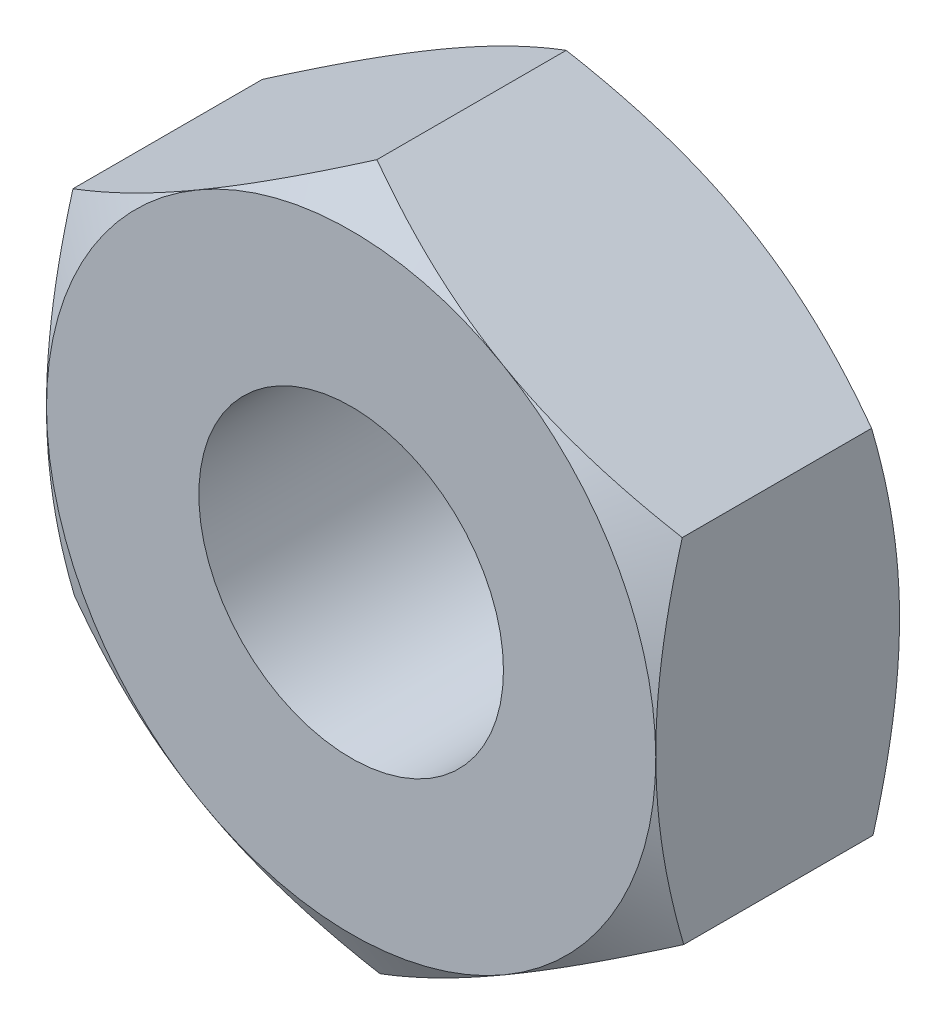
ISO-10303-21;
HEADER;
FILE_DESCRIPTION(('STEP AP214'),'2;1');
FILE_NAME('part.step','',(''),(''),'','','');
FILE_SCHEMA(('AUTOMOTIVE_DESIGN { 1 0 10303 214 1 1 1 1 }'));
ENDSEC;
DATA;
#1=APPLICATION_CONTEXT('core data for automotive mechanical design processes');
#2=APPLICATION_PROTOCOL_DEFINITION('international standard','automotive_design',2000,#1);
#3=PRODUCT_CONTEXT('',#1,'mechanical');
#4=PRODUCT('Part','Part','',(#3));
#5=PRODUCT_RELATED_PRODUCT_CATEGORY('part','',(#4));
#6=PRODUCT_DEFINITION_FORMATION('','',#4);
#7=PRODUCT_DEFINITION_CONTEXT('part definition',#1,'design');
#8=PRODUCT_DEFINITION('design','',#6,#7);
#9=PRODUCT_DEFINITION_SHAPE('','',#8);
#10=(LENGTH_UNIT() NAMED_UNIT(*) SI_UNIT(.MILLI.,.METRE.));
#11=(NAMED_UNIT(*) PLANE_ANGLE_UNIT() SI_UNIT($,.RADIAN.));
#12=(NAMED_UNIT(*) SI_UNIT($,.STERADIAN.) SOLID_ANGLE_UNIT());
#13=UNCERTAINTY_MEASURE_WITH_UNIT(LENGTH_MEASURE(1.E-05),#10,'distance_accuracy_value','');
#14=(GEOMETRIC_REPRESENTATION_CONTEXT(3) GLOBAL_UNCERTAINTY_ASSIGNED_CONTEXT((#13)) GLOBAL_UNIT_ASSIGNED_CONTEXT((#10,
#11,#12)) REPRESENTATION_CONTEXT('',''));
#15=CARTESIAN_POINT('',(0.,0.,0.));
#16=DIRECTION('',(0.,0.,1.));
#17=DIRECTION('',(1.,0.,0.));
#18=AXIS2_PLACEMENT_3D('',#15,#16,#17);
#19=CARTESIAN_POINT('',(0.,0.,4.));
#20=DIRECTION('',(0.,0.,1.));
#21=DIRECTION('',(1.,0.,0.));
#22=AXIS2_PLACEMENT_3D('',#19,#20,#21);
#23=PLANE('',#22);
#24=CARTESIAN_POINT('',(0.,0.,4.));
#25=DIRECTION('',(0.,0.,1.));
#26=DIRECTION('',(1.,0.,0.));
#27=AXIS2_PLACEMENT_3D('',#24,#25,#26);
#28=CIRCLE('',#27,5.);
#29=CARTESIAN_POINT('',(5.,0.,4.));
#30=VERTEX_POINT('',#29);
#31=EDGE_CURVE('E256',#30,#30,#28,.T.);
#32=ORIENTED_EDGE('',*,*,#31,.F.);
#33=EDGE_LOOP('',(#32));
#34=FACE_BOUND('',#33,.T.);
#35=CARTESIAN_POINT('',(0.,0.,4.));
#36=DIRECTION('',(0.,0.,1.));
#37=DIRECTION('',(1.,0.,0.));
#38=AXIS2_PLACEMENT_3D('',#35,#36,#37);
#39=CIRCLE('',#38,10.);
#40=CARTESIAN_POINT('',(5.03532607512234,-8.63976222573244,4.));
#41=VERTEX_POINT('',#40);
#42=CARTESIAN_POINT('',(-4.9645905325803,-8.68060141026035,4.));
#43=VERTEX_POINT('',#42);
#44=EDGE_CURVE('E12',#41,#43,#39,.F.);
#45=ORIENTED_EDGE('',*,*,#44,.F.);
#46=CARTESIAN_POINT('',(9.99991660770264,0.0408391845279188,4.));
#47=VERTEX_POINT('',#46);
#48=EDGE_CURVE('E50',#47,#41,#39,.F.);
#49=ORIENTED_EDGE('',*,*,#48,.F.);
#50=CARTESIAN_POINT('',(4.96459053258031,8.68060141026035,4.));
#51=VERTEX_POINT('',#50);
#52=EDGE_CURVE('E160',#51,#47,#39,.F.);
#53=ORIENTED_EDGE('',*,*,#52,.F.);
#54=CARTESIAN_POINT('',(0.,0.,4.));
#55=DIRECTION('',(0.,0.,-1.));
#56=DIRECTION('',(-1.,0.,0.));
#57=AXIS2_PLACEMENT_3D('',#54,#55,#56);
#58=CIRCLE('',#57,10.);
#59=CARTESIAN_POINT('',(-5.03532607512234,8.63976222573243,4.));
#60=VERTEX_POINT('',#59);
#61=EDGE_CURVE('E219',#60,#51,#58,.T.);
#62=ORIENTED_EDGE('',*,*,#61,.F.);
#63=CARTESIAN_POINT('',(-9.99991660770264,-0.0408391845279113,4.));
#64=VERTEX_POINT('',#63);
#65=EDGE_CURVE('E389',#64,#60,#39,.F.);
#66=ORIENTED_EDGE('',*,*,#65,.F.);
#67=EDGE_CURVE('E56',#43,#64,#39,.F.);
#68=ORIENTED_EDGE('',*,*,#67,.F.);
#69=EDGE_LOOP('',(#45,#49,#53,#62,#66,#68));
#70=FACE_BOUND('',#69,.T.);
#71=ADVANCED_FACE('F45',(#34,#70),#23,.T.);
#72=CARTESIAN_POINT('',(0.,0.,-4.));
#73=DIRECTION('',(0.,0.,1.));
#74=DIRECTION('',(1.,0.,0.));
#75=AXIS2_PLACEMENT_3D('',#72,#73,#74);
#76=PLANE('',#75);
#77=CARTESIAN_POINT('',(0.,0.,-4.));
#78=DIRECTION('',(0.,0.,1.));
#79=DIRECTION('',(1.,0.,0.));
#80=AXIS2_PLACEMENT_3D('',#77,#78,#79);
#81=CIRCLE('',#80,5.);
#82=CARTESIAN_POINT('',(5.,0.,-4.));
#83=VERTEX_POINT('',#82);
#84=EDGE_CURVE('E257',#83,#83,#81,.T.);
#85=ORIENTED_EDGE('',*,*,#84,.T.);
#86=EDGE_LOOP('',(#85));
#87=FACE_BOUND('',#86,.T.);
#88=CARTESIAN_POINT('',(0.,0.,-4.));
#89=DIRECTION('',(0.,0.,-1.));
#90=DIRECTION('',(-1.,0.,0.));
#91=AXIS2_PLACEMENT_3D('',#88,#89,#90);
#92=CIRCLE('',#91,10.);
#93=CARTESIAN_POINT('',(4.96459053258031,8.68060141026036,-4.));
#94=VERTEX_POINT('',#93);
#95=CARTESIAN_POINT('',(9.99991660770264,0.0408391845279188,-4.));
#96=VERTEX_POINT('',#95);
#97=EDGE_CURVE('E326',#94,#96,#92,.T.);
#98=ORIENTED_EDGE('',*,*,#97,.T.);
#99=CARTESIAN_POINT('',(5.03532607512234,-8.63976222573243,-4.));
#100=VERTEX_POINT('',#99);
#101=EDGE_CURVE('E333',#96,#100,#92,.T.);
#102=ORIENTED_EDGE('',*,*,#101,.T.);
#103=CARTESIAN_POINT('',(-4.9645905325803,-8.68060141026035,-4.));
#104=VERTEX_POINT('',#103);
#105=EDGE_CURVE('E322',#100,#104,#92,.T.);
#106=ORIENTED_EDGE('',*,*,#105,.T.);
#107=CARTESIAN_POINT('',(-9.99991660770264,-0.0408391845279113,-4.));
#108=VERTEX_POINT('',#107);
#109=EDGE_CURVE('E316',#104,#108,#92,.T.);
#110=ORIENTED_EDGE('',*,*,#109,.T.);
#111=CARTESIAN_POINT('',(-5.03532607512234,8.63976222573244,-4.));
#112=VERTEX_POINT('',#111);
#113=EDGE_CURVE('E313',#108,#112,#92,.T.);
#114=ORIENTED_EDGE('',*,*,#113,.T.);
#115=EDGE_CURVE('E317',#112,#94,#92,.T.);
#116=ORIENTED_EDGE('',*,*,#115,.T.);
#117=EDGE_LOOP('',(#98,#102,#106,#110,#114,#116));
#118=FACE_BOUND('',#117,.T.);
#119=ADVANCED_FACE('F227',(#87,#118),#76,.F.);
#120=CARTESIAN_POINT('',(0.0471570283613514,-11.5469090906619,4.));
#121=DIRECTION('',(-0.503532607512233,0.863976222573243,0.));
#122=DIRECTION('',(-0.863976222573244,-0.503532607512234,0.));
#123=AXIS2_PLACEMENT_3D('',#120,#121,#122);
#124=PLANE('',#123);
#125=DIRECTION('',(0.,0.,-1.));
#126=VECTOR('',#125,1.);
#127=CARTESIAN_POINT('',(10.0234951218833,-5.73261536080301,4.));
#128=LINE('',#127,#126);
#129=CARTESIAN_POINT('',(10.0234951218833,-5.73261536080301,3.1068360252296));
#130=VERTEX_POINT('',#129);
#131=CARTESIAN_POINT('',(10.0234951218833,-5.73261536080301,-3.1068360252296));
#132=VERTEX_POINT('',#131);
#133=EDGE_CURVE('E165',#130,#132,#128,.T.);
#134=ORIENTED_EDGE('',*,*,#133,.F.);
#135=CARTESIAN_POINT('',(10.0236951218833,-5.73249879912125,3.10676919943801));
#136=CARTESIAN_POINT('',(9.8043934824191,-5.86030963866292,3.18003117071796));
#137=CARTESIAN_POINT('',(9.58427417198534,-5.98859702372126,3.24996801006524));
#138=CARTESIAN_POINT('',(9.14227035786886,-6.24620056330658,3.38226880062709));
#139=CARTESIAN_POINT('',(8.92038529903801,-6.37551704137856,3.44463026113388));
#140=CARTESIAN_POINT('',(8.25115488474094,-6.7655501542504,3.61914472962219));
#141=CARTESIAN_POINT('',(7.80116765317343,-7.02780649665708,3.71840771304211));
#142=CARTESIAN_POINT('',(7.12778236221893,-7.42026110658237,3.83480275689092));
#143=CARTESIAN_POINT('',(6.90639608398435,-7.5492868911287,3.86795931829593));
#144=CARTESIAN_POINT('',(6.4625985250812,-7.80793584025892,3.9235607234498));
#145=CARTESIAN_POINT('',(6.24018722476748,-7.93755901629217,3.94600536102896));
#146=CARTESIAN_POINT('',(5.79499362957969,-8.19702158710805,3.97960783245586));
#147=CARTESIAN_POINT('',(5.57221209219253,-8.32686054042095,3.99077907887235));
#148=CARTESIAN_POINT('',(5.1264432397431,-8.58665837600614,4.00159739053961));
#149=CARTESIAN_POINT('',(4.90345593125148,-8.71661725444901,4.00124481184567));
#150=CARTESIAN_POINT('',(4.48657631588531,-8.95957819973848,3.98981719704419));
#151=CARTESIAN_POINT('',(4.29265458448195,-9.07259741544791,3.98013618860361));
#152=CARTESIAN_POINT('',(3.90526466407321,-9.29837151854348,3.95224652128214));
#153=CARTESIAN_POINT('',(3.71179650812355,-9.41112638666446,3.9340372591729));
#154=CARTESIAN_POINT('',(3.13214168623567,-9.74895409105769,3.86704760285208));
#155=CARTESIAN_POINT('',(2.74698104881237,-9.97342894928376,3.80591368481485));
#156=CARTESIAN_POINT('',(1.97257417130124,-10.4247597893238,3.65307842197185));
#157=CARTESIAN_POINT('',(1.58342676141163,-10.6515581720672,3.56072923483583));
#158=CARTESIAN_POINT('',(0.810935032241205,-11.1017728475501,3.35113496669802));
#159=CARTESIAN_POINT('',(0.42758082110536,-11.325194905346,3.23393911169943));
#160=CARTESIAN_POINT('',(0.0469570283613517,-11.5470256523436,3.10676919943801));
#161=B_SPLINE_CURVE_WITH_KNOTS('',3,(#135,#136,#137,#138,#139,#140,#141,#142,#143,#144,#145,
#146,#147,#148,#149,#150,#151,#152,#153,#154,#155,#156,#157,#158,#159,#160),.UNSPECIFIED.,.F.,
.F.,(4,2,2,2,2,2,2,2,2,2,2,2,4),(0.,0.792505395803816,1.58527065810783,3.17417596925612,
3.94912788860386,4.72409472265379,5.49813844545388,6.27215825240161,6.94597423179127,
7.61983787935609,8.96852276378645,10.3471181760619,11.7230074323937),.UNSPECIFIED.);
#162=EDGE_CURVE('E147',#130,#41,#161,.T.);
#163=ORIENTED_EDGE('',*,*,#162,.T.);
#164=CARTESIAN_POINT('',(0.0471570283613516,-11.5469090906619,3.1068360252296));
#165=VERTEX_POINT('',#164);
#166=EDGE_CURVE('E136',#41,#165,#161,.T.);
#167=ORIENTED_EDGE('',*,*,#166,.T.);
#168=DIRECTION('',(0.,0.,-1.));
#169=VECTOR('',#168,1.);
#170=CARTESIAN_POINT('',(0.0471570283613514,-11.5469090906619,4.));
#171=LINE('',#170,#169);
#172=CARTESIAN_POINT('',(0.0471570283613516,-11.5469090906619,-3.1068360252296));
#173=VERTEX_POINT('',#172);
#174=EDGE_CURVE('E253',#165,#173,#171,.T.);
#175=ORIENTED_EDGE('',*,*,#174,.T.);
#176=CARTESIAN_POINT('',(10.0236951218833,-5.73249879912125,-3.10676919943801));
#177=CARTESIAN_POINT('',(9.8043934824191,-5.86030963866292,-3.18003117071796));
#178=CARTESIAN_POINT('',(9.58427417198534,-5.98859702372126,-3.24996801006524));
#179=CARTESIAN_POINT('',(9.14227035786886,-6.24620056330658,-3.38226880062709));
#180=CARTESIAN_POINT('',(8.92038529903801,-6.37551704137856,-3.44463026113388));
#181=CARTESIAN_POINT('',(8.25115488474094,-6.7655501542504,-3.61914472962219));
#182=CARTESIAN_POINT('',(7.80116765317343,-7.02780649665708,-3.71840771304211));
#183=CARTESIAN_POINT('',(7.12778236221893,-7.42026110658237,-3.83480275689092));
#184=CARTESIAN_POINT('',(6.90639608398435,-7.5492868911287,-3.86795931829593));
#185=CARTESIAN_POINT('',(6.4625985250812,-7.80793584025892,-3.9235607234498));
#186=CARTESIAN_POINT('',(6.24018722476748,-7.93755901629217,-3.94600536102896));
#187=CARTESIAN_POINT('',(5.79499362957969,-8.19702158710805,-3.97960783245586));
#188=CARTESIAN_POINT('',(5.57221209219253,-8.32686054042095,-3.99077907887235));
#189=CARTESIAN_POINT('',(5.1264432397431,-8.58665837600614,-4.00159739053961));
#190=CARTESIAN_POINT('',(4.90345593125148,-8.71661725444901,-4.00124481184567));
#191=CARTESIAN_POINT('',(4.48657631588531,-8.95957819973848,-3.98981719704419));
#192=CARTESIAN_POINT('',(4.29265458448195,-9.07259741544791,-3.98013618860361));
#193=CARTESIAN_POINT('',(3.90526466407321,-9.29837151854348,-3.95224652128214));
#194=CARTESIAN_POINT('',(3.71179650812355,-9.41112638666446,-3.9340372591729));
#195=CARTESIAN_POINT('',(3.13214168623567,-9.74895409105769,-3.86704760285208));
#196=CARTESIAN_POINT('',(2.74698104881237,-9.97342894928376,-3.80591368481485));
#197=CARTESIAN_POINT('',(1.97257417130124,-10.4247597893238,-3.65307842197185));
#198=CARTESIAN_POINT('',(1.58342676141163,-10.6515581720672,-3.56072923483583));
#199=CARTESIAN_POINT('',(0.810935032241205,-11.1017728475501,-3.35113496669802));
#200=CARTESIAN_POINT('',(0.42758082110536,-11.325194905346,-3.23393911169943));
#201=CARTESIAN_POINT('',(0.0469570283613517,-11.5470256523436,-3.10676919943801));
#202=B_SPLINE_CURVE_WITH_KNOTS('',3,(#176,#177,#178,#179,#180,#181,#182,#183,#184,#185,#186,
#187,#188,#189,#190,#191,#192,#193,#194,#195,#196,#197,#198,#199,#200,#201),.UNSPECIFIED.,.F.,
.F.,(4,2,2,2,2,2,2,2,2,2,2,2,4),(0.,0.792505395803816,1.58527065810783,3.17417596925612,
3.94912788860386,4.72409472265379,5.49813844545388,6.27215825240161,6.94597423179127,
7.61983787935609,8.96852276378645,10.3471181760619,11.7230074323937),.UNSPECIFIED.);
#203=EDGE_CURVE('E331',#100,#173,#202,.T.);
#204=ORIENTED_EDGE('',*,*,#203,.F.);
#205=EDGE_CURVE('E359',#132,#100,#202,.T.);
#206=ORIENTED_EDGE('',*,*,#205,.F.);
#207=EDGE_LOOP('',(#134,#163,#167,#175,#204,#206));
#208=FACE_BOUND('',#207,.T.);
#209=ADVANCED_FACE('F47',(#208),#124,.F.);
#210=CARTESIAN_POINT('',(10.0234951218833,-5.73261536080301,4.));
#211=DIRECTION('',(-0.999991660770264,-0.00408391845279188,0.));
#212=DIRECTION('',(0.00408391845279188,-0.999991660770264,0.));
#213=AXIS2_PLACEMENT_3D('',#210,#211,#212);
#214=PLANE('',#213);
#215=DIRECTION('',(0.,0.,-1.));
#216=VECTOR('',#215,1.);
#217=CARTESIAN_POINT('',(9.97633809352196,5.81429372985885,4.));
#218=LINE('',#217,#216);
#219=CARTESIAN_POINT('',(9.97633809352196,5.81429372985885,3.1068360252296));
#220=VERTEX_POINT('',#219);
#221=CARTESIAN_POINT('',(9.97633809352196,5.81429372985885,-3.1068360252296));
#222=VERTEX_POINT('',#221);
#223=EDGE_CURVE('E241',#220,#222,#218,.T.);
#224=ORIENTED_EDGE('',*,*,#223,.F.);
#225=CARTESIAN_POINT('',(9.97633727673146,5.81449372985885,3.1067782889712));
#226=CARTESIAN_POINT('',(9.97737388983869,5.56066778434707,3.18003988416956));
#227=CARTESIAN_POINT('',(9.97841436797933,5.30589544354607,3.24997633834016));
#228=CARTESIAN_POINT('',(9.98050366810825,4.79430768049104,3.3822763418692));
#229=CARTESIAN_POINT('',(9.98155249272064,4.53749161569424,3.4446374005158));
#230=CARTESIAN_POINT('',(9.98471586617766,3.76290536636229,3.61915063532307));
#231=CARTESIAN_POINT('',(9.98684290282256,3.24207740869403,3.71841276564075));
#232=CARTESIAN_POINT('',(9.99002591575877,2.46268222019448,3.83480653831842));
#233=CARTESIAN_POINT('',(9.99107238268317,2.20644346083353,3.86796268396858));
#234=CARTESIAN_POINT('',(9.99317016153645,1.69277959029409,3.92356326154778));
#235=CARTESIAN_POINT('',(9.9942214735582,1.43535445637751,3.94600748730253));
#236=CARTESIAN_POINT('',(9.99632585119337,0.920074802633136,3.97960914964751));
#237=CARTESIAN_POINT('',(9.99737891322635,0.66222115951201,3.9907799986411));
#238=CARTESIAN_POINT('',(9.99948600990799,0.146275717792408,4.00159753950855));
#239=CARTESIAN_POINT('',(10.0005400445256,-0.11181607320127,4.0012445874497));
#240=CARTESIAN_POINT('',(10.0025105767246,-0.594322222406531,3.98981635446337));
#241=CARTESIAN_POINT('',(10.0034272134084,-0.818770641330599,3.98013517646816));
#242=CARTESIAN_POINT('',(10.0052583429432,-1.26714253850207,3.95224535359026));
#243=CARTESIAN_POINT('',(10.0061728356379,-1.49106597849121,3.93403610551087));
#244=CARTESIAN_POINT('',(10.0089127702457,-2.16196863985729,3.86704675825804));
#245=CARTESIAN_POINT('',(10.0107333623112,-2.60776032356731,3.80591340230996));
#246=CARTESIAN_POINT('',(10.014393858092,-3.50407235755105,3.65307989532971));
#247=CARTESIAN_POINT('',(10.016233294665,-3.95447832300112,3.56073192457727));
#248=CARTESIAN_POINT('',(10.0198847379151,-4.8485737468165,3.35114055134797));
#249=CARTESIAN_POINT('',(10.0216967913475,-5.29227465373743,3.233946372579));
#250=CARTESIAN_POINT('',(10.0234959386738,-5.73281536080301,3.1067782889712));
#251=B_SPLINE_CURVE_WITH_KNOTS('',3,(#225,#226,#227,#228,#229,#230,#231,#232,#233,#234,#235,
#236,#237,#238,#239,#240,#241,#242,#243,#244,#245,#246,#247,#248,#249,#250),.UNSPECIFIED.,.F.,
.F.,(4,2,2,2,2,2,2,2,2,2,2,2,4),(0.,0.792504318570143,1.58526850314422,3.17417159939924,
3.94912254368936,4.72408840300143,5.49813116247778,6.27215000527567,6.94595901478179,
7.6198156904971,8.96848658855462,10.3470672744631,11.7229419088435),.UNSPECIFIED.);
#252=EDGE_CURVE('E297',#220,#47,#251,.T.);
#253=ORIENTED_EDGE('',*,*,#252,.T.);
#254=EDGE_CURVE('E155',#47,#130,#251,.T.);
#255=ORIENTED_EDGE('',*,*,#254,.T.);
#256=ORIENTED_EDGE('',*,*,#133,.T.);
#257=CARTESIAN_POINT('',(9.97633727673146,5.81449372985885,-3.1067782889712));
#258=CARTESIAN_POINT('',(9.97737388983869,5.56066778434707,-3.18003988416956));
#259=CARTESIAN_POINT('',(9.97841436797933,5.30589544354607,-3.24997633834016));
#260=CARTESIAN_POINT('',(9.98050366810825,4.79430768049104,-3.3822763418692));
#261=CARTESIAN_POINT('',(9.98155249272064,4.53749161569424,-3.4446374005158));
#262=CARTESIAN_POINT('',(9.98471586617766,3.76290536636229,-3.61915063532307));
#263=CARTESIAN_POINT('',(9.98684290282256,3.24207740869403,-3.71841276564075));
#264=CARTESIAN_POINT('',(9.99002591575877,2.46268222019448,-3.83480653831842));
#265=CARTESIAN_POINT('',(9.99107238268317,2.20644346083353,-3.86796268396858));
#266=CARTESIAN_POINT('',(9.99317016153645,1.69277959029409,-3.92356326154778));
#267=CARTESIAN_POINT('',(9.9942214735582,1.43535445637751,-3.94600748730253));
#268=CARTESIAN_POINT('',(9.99632585119337,0.920074802633136,-3.97960914964751));
#269=CARTESIAN_POINT('',(9.99737891322635,0.66222115951201,-3.9907799986411));
#270=CARTESIAN_POINT('',(9.99948600990799,0.146275717792408,-4.00159753950855));
#271=CARTESIAN_POINT('',(10.0005400445256,-0.11181607320127,-4.0012445874497));
#272=CARTESIAN_POINT('',(10.0025105767246,-0.594322222406531,-3.98981635446337));
#273=CARTESIAN_POINT('',(10.0034272134084,-0.818770641330599,-3.98013517646816));
#274=CARTESIAN_POINT('',(10.0052583429432,-1.26714253850207,-3.95224535359026));
#275=CARTESIAN_POINT('',(10.0061728356379,-1.49106597849121,-3.93403610551087));
#276=CARTESIAN_POINT('',(10.0089127702457,-2.16196863985729,-3.86704675825804));
#277=CARTESIAN_POINT('',(10.0107333623112,-2.60776032356731,-3.80591340230996));
#278=CARTESIAN_POINT('',(10.014393858092,-3.50407235755105,-3.65307989532971));
#279=CARTESIAN_POINT('',(10.016233294665,-3.95447832300112,-3.56073192457727));
#280=CARTESIAN_POINT('',(10.0198847379151,-4.8485737468165,-3.35114055134797));
#281=CARTESIAN_POINT('',(10.0216967913475,-5.29227465373743,-3.233946372579));
#282=CARTESIAN_POINT('',(10.0234959386738,-5.73281536080301,-3.1067782889712));
#283=B_SPLINE_CURVE_WITH_KNOTS('',3,(#257,#258,#259,#260,#261,#262,#263,#264,#265,#266,#267,
#268,#269,#270,#271,#272,#273,#274,#275,#276,#277,#278,#279,#280,#281,#282),.UNSPECIFIED.,.F.,
.F.,(4,2,2,2,2,2,2,2,2,2,2,2,4),(0.,0.792504318570143,1.58526850314422,3.17417159939924,
3.94912254368936,4.72408840300143,5.49813116247778,6.27215000527567,6.94595901478179,
7.6198156904971,8.96848658855462,10.3470672744631,11.7229419088435),.UNSPECIFIED.);
#284=EDGE_CURVE('E274',#96,#132,#283,.T.);
#285=ORIENTED_EDGE('',*,*,#284,.F.);
#286=EDGE_CURVE('E430',#222,#96,#283,.T.);
#287=ORIENTED_EDGE('',*,*,#286,.F.);
#288=EDGE_LOOP('',(#224,#253,#255,#256,#285,#287));
#289=FACE_BOUND('',#288,.T.);
#290=ADVANCED_FACE('F284',(#289),#214,.F.);
#291=CARTESIAN_POINT('',(9.97633809352196,5.81429372985885,4.));
#292=DIRECTION('',(-0.49645905325803,-0.868060141026035,0.));
#293=DIRECTION('',(0.868060141026035,-0.49645905325803,0.));
#294=AXIS2_PLACEMENT_3D('',#291,#292,#293);
#295=PLANE('',#294);
#296=DIRECTION('',(0.,0.,-1.));
#297=VECTOR('',#296,1.);
#298=CARTESIAN_POINT('',(-0.0471570283613551,11.5469090906619,4.));
#299=LINE('',#298,#297);
#300=CARTESIAN_POINT('',(-0.0471570283613551,11.5469090906619,3.10683602522959));
#301=VERTEX_POINT('',#300);
#302=CARTESIAN_POINT('',(-0.0471570283613551,11.5469090906619,-3.10683602522959));
#303=VERTEX_POINT('',#302);
#304=EDGE_CURVE('E244',#301,#303,#299,.T.);
#305=ORIENTED_EDGE('',*,*,#304,.F.);
#306=CARTESIAN_POINT('',(-0.0473570283613551,11.5470234742235,3.10676951383461));
#307=CARTESIAN_POINT('',(0.172981217332305,11.4210081076795,3.18003147210637));
#308=CARTESIAN_POINT('',(0.394140998995181,11.2945228900847,3.24996829813085));
#309=CARTESIAN_POINT('',(0.83823409927543,11.0405381375271,3.38226906147019));
#310=CARTESIAN_POINT('',(1.06116797566499,10.9130382835646,3.44463050807713));
#311=CARTESIAN_POINT('',(1.73356174144999,10.5284843147766,3.61914493389391));
#312=CARTESIAN_POINT('',(2.18567599442304,10.2699121221516,3.71840788780606));
#313=CARTESIAN_POINT('',(2.86224427535644,9.8829706738096,3.83480288768659));
#314=CARTESIAN_POINT('',(3.08467701340973,9.75575742978597,3.86795943471114));
#315=CARTESIAN_POINT('',(3.53057233653066,9.50074195389147,3.92356081124019));
#316=CARTESIAN_POINT('',(3.75403494133635,9.37293971073206,3.94600543457484));
#317=CARTESIAN_POINT('',(4.20133289873193,9.11712204331746,3.97960787801656));
#318=CARTESIAN_POINT('',(4.42516749025532,8.98910705432978,3.99077911068666));
#319=CARTESIAN_POINT('',(4.87304342313379,8.73295883244381,4.00159739569287));
#320=CARTESIAN_POINT('',(5.09708475788716,8.60482560332116,4.00124480408468));
#321=CARTESIAN_POINT('',(5.51593483643085,8.36527778442803,3.9898171679008));
#322=CARTESIAN_POINT('',(5.71077314395324,8.25384628663269,3.98013615359545));
#323=CARTESIAN_POINT('',(6.0999940728379,8.03124390607195,3.95224648089331));
#324=CARTESIAN_POINT('',(6.29437666098823,7.92007304230105,3.93403721926929));
#325=CARTESIAN_POINT('',(6.87677123610096,7.58699121338384,3.86704757363862));
#326=CARTESIAN_POINT('',(7.26375234517092,7.36566982566233,3.80591367504335));
#327=CARTESIAN_POINT('',(8.04181947422858,6.92067937856429,3.65307847293358));
#328=CARTESIAN_POINT('',(8.43280619698415,6.69706710904313,3.56072932787088));
#329=CARTESIAN_POINT('',(9.20894912618801,6.25317714610806,3.35113515986468));
#330=CARTESIAN_POINT('',(9.59411527123189,6.03289376863433,3.23393936284499));
#331=CARTESIAN_POINT('',(9.97653809352196,5.81417934629721,3.10676951383462));
#332=B_SPLINE_CURVE_WITH_KNOTS('',3,(#306,#307,#308,#309,#310,#311,#312,#313,#314,#315,#316,
#317,#318,#319,#320,#321,#322,#323,#324,#325,#326,#327,#328,#329,#330,#331),.UNSPECIFIED.,.F.,
.F.,(4,2,2,2,2,2,2,2,2,2,2,2,4),(0.,0.792505358543536,1.58527058357011,3.17417581810776,
3.94912770372936,4.72409450406422,5.49813819354404,6.27215796714293,6.94597370545279,
7.61983711186981,8.96852151252853,10.3471164154366,11.7230051660128),.UNSPECIFIED.);
#333=EDGE_CURVE('E309',#301,#51,#332,.T.);
#334=ORIENTED_EDGE('',*,*,#333,.T.);
#335=EDGE_CURVE('E202',#51,#220,#332,.T.);
#336=ORIENTED_EDGE('',*,*,#335,.T.);
#337=ORIENTED_EDGE('',*,*,#223,.T.);
#338=CARTESIAN_POINT('',(-0.0473570283613551,11.5470234742235,-3.10676951383461));
#339=CARTESIAN_POINT('',(0.172981217332305,11.4210081076795,-3.18003147210637));
#340=CARTESIAN_POINT('',(0.394140998995181,11.2945228900847,-3.24996829813085));
#341=CARTESIAN_POINT('',(0.83823409927543,11.0405381375271,-3.38226906147019));
#342=CARTESIAN_POINT('',(1.06116797566499,10.9130382835646,-3.44463050807713));
#343=CARTESIAN_POINT('',(1.73356174144999,10.5284843147766,-3.61914493389391));
#344=CARTESIAN_POINT('',(2.18567599442304,10.2699121221516,-3.71840788780606));
#345=CARTESIAN_POINT('',(2.86224427535644,9.8829706738096,-3.83480288768659));
#346=CARTESIAN_POINT('',(3.08467701340973,9.75575742978597,-3.86795943471114));
#347=CARTESIAN_POINT('',(3.53057233653066,9.50074195389147,-3.92356081124019));
#348=CARTESIAN_POINT('',(3.75403494133635,9.37293971073206,-3.94600543457484));
#349=CARTESIAN_POINT('',(4.20133289873193,9.11712204331746,-3.97960787801656));
#350=CARTESIAN_POINT('',(4.42516749025532,8.98910705432978,-3.99077911068666));
#351=CARTESIAN_POINT('',(4.87304342313379,8.73295883244381,-4.00159739569287));
#352=CARTESIAN_POINT('',(5.09708475788716,8.60482560332116,-4.00124480408468));
#353=CARTESIAN_POINT('',(5.51593483643085,8.36527778442803,-3.9898171679008));
#354=CARTESIAN_POINT('',(5.71077314395324,8.25384628663269,-3.98013615359545));
#355=CARTESIAN_POINT('',(6.0999940728379,8.03124390607195,-3.95224648089331));
#356=CARTESIAN_POINT('',(6.29437666098823,7.92007304230105,-3.93403721926929));
#357=CARTESIAN_POINT('',(6.87677123610096,7.58699121338384,-3.86704757363862));
#358=CARTESIAN_POINT('',(7.26375234517092,7.36566982566233,-3.80591367504335));
#359=CARTESIAN_POINT('',(8.04181947422858,6.92067937856429,-3.65307847293358));
#360=CARTESIAN_POINT('',(8.43280619698415,6.69706710904313,-3.56072932787088));
#361=CARTESIAN_POINT('',(9.20894912618801,6.25317714610806,-3.35113515986468));
#362=CARTESIAN_POINT('',(9.59411527123189,6.03289376863433,-3.23393936284499));
#363=CARTESIAN_POINT('',(9.97653809352196,5.81417934629721,-3.10676951383462));
#364=B_SPLINE_CURVE_WITH_KNOTS('',3,(#338,#339,#340,#341,#342,#343,#344,#345,#346,#347,#348,
#349,#350,#351,#352,#353,#354,#355,#356,#357,#358,#359,#360,#361,#362,#363),.UNSPECIFIED.,.F.,
.F.,(4,2,2,2,2,2,2,2,2,2,2,2,4),(0.,0.792505358543536,1.58527058357011,3.17417581810776,
3.94912770372936,4.72409450406422,5.49813819354404,6.27215796714293,6.94597370545279,
7.61983711186981,8.96852151252853,10.3471164154366,11.7230051660128),.UNSPECIFIED.);
#365=EDGE_CURVE('E265',#94,#222,#364,.T.);
#366=ORIENTED_EDGE('',*,*,#365,.F.);
#367=EDGE_CURVE('E261',#303,#94,#364,.T.);
#368=ORIENTED_EDGE('',*,*,#367,.F.);
#369=EDGE_LOOP('',(#305,#334,#336,#337,#366,#368));
#370=FACE_BOUND('',#369,.T.);
#371=ADVANCED_FACE('F280',(#370),#295,.F.);
#372=CARTESIAN_POINT('',(-0.0471570283613551,11.5469090906619,4.));
#373=DIRECTION('',(0.503532607512234,-0.863976222573243,0.));
#374=DIRECTION('',(0.863976222573243,0.503532607512234,0.));
#375=AXIS2_PLACEMENT_3D('',#372,#373,#374);
#376=PLANE('',#375);
#377=DIRECTION('',(0.,0.,-1.));
#378=VECTOR('',#377,1.);
#379=CARTESIAN_POINT('',(-10.0234951218833,5.73261536080301,4.));
#380=LINE('',#379,#378);
#381=CARTESIAN_POINT('',(-10.0234951218833,5.73261536080301,3.1068360252296));
#382=VERTEX_POINT('',#381);
#383=CARTESIAN_POINT('',(-10.0234951218833,5.73261536080301,-3.1068360252296));
#384=VERTEX_POINT('',#383);
#385=EDGE_CURVE('E247',#382,#384,#380,.T.);
#386=ORIENTED_EDGE('',*,*,#385,.F.);
#387=CARTESIAN_POINT('',(-10.0236951218833,5.73249879912126,3.10676919943801));
#388=CARTESIAN_POINT('',(-9.8043934824191,5.86030963866292,3.18003117071796));
#389=CARTESIAN_POINT('',(-9.58427417198534,5.98859702372127,3.24996801006524));
#390=CARTESIAN_POINT('',(-9.14227035786886,6.24620056330659,3.38226880062709));
#391=CARTESIAN_POINT('',(-8.92038529903801,6.37551704137857,3.44463026113388));
#392=CARTESIAN_POINT('',(-8.25115488474094,6.76555015425041,3.61914472962219));
#393=CARTESIAN_POINT('',(-7.80116765317343,7.02780649665709,3.71840771304211));
#394=CARTESIAN_POINT('',(-7.12778236221893,7.42026110658237,3.83480275689092));
#395=CARTESIAN_POINT('',(-6.90639608398434,7.54928689112871,3.86795931829593));
#396=CARTESIAN_POINT('',(-6.4625985250812,7.80793584025893,3.92356072344979));
#397=CARTESIAN_POINT('',(-6.24018722476747,7.93755901629218,3.94600536102895));
#398=CARTESIAN_POINT('',(-5.79499362957969,8.19702158710806,3.97960783245586));
#399=CARTESIAN_POINT('',(-5.57221209219253,8.32686054042096,3.99077907887235));
#400=CARTESIAN_POINT('',(-5.1264432397431,8.58665837600615,4.00159739053961));
#401=CARTESIAN_POINT('',(-4.90345593125148,8.71661725444902,4.00124481184566));
#402=CARTESIAN_POINT('',(-4.4865763158853,8.95957819973849,3.98981719704418));
#403=CARTESIAN_POINT('',(-4.29265458448195,9.07259741544792,3.98013618860361));
#404=CARTESIAN_POINT('',(-3.9052646640732,9.29837151854349,3.95224652128213));
#405=CARTESIAN_POINT('',(-3.71179650812355,9.41112638666447,3.93403725917289));
#406=CARTESIAN_POINT('',(-3.13214168623566,9.74895409105769,3.86704760285208));
#407=CARTESIAN_POINT('',(-2.74698104881237,9.97342894928377,3.80591368481485));
#408=CARTESIAN_POINT('',(-1.97257417130124,10.4247597893238,3.65307842197185));
#409=CARTESIAN_POINT('',(-1.58342676141163,10.6515581720672,3.56072923483582));
#410=CARTESIAN_POINT('',(-0.810935032241206,11.1017728475501,3.35113496669801));
#411=CARTESIAN_POINT('',(-0.427580821105362,11.325194905346,3.23393911169943));
#412=CARTESIAN_POINT('',(-0.0469570283613555,11.5470256523436,3.106769199438));
#413=B_SPLINE_CURVE_WITH_KNOTS('',3,(#387,#388,#389,#390,#391,#392,#393,#394,#395,#396,#397,
#398,#399,#400,#401,#402,#403,#404,#405,#406,#407,#408,#409,#410,#411,#412),.UNSPECIFIED.,.F.,
.F.,(4,2,2,2,2,2,2,2,2,2,2,2,4),(0.,0.792505395803818,1.58527065810784,3.17417596925612,
3.94912788860386,4.72409472265379,5.49813844545388,6.27215825240162,6.94597423179127,
7.61983787935609,8.96852276378645,10.3471181760619,11.7230074323937),.UNSPECIFIED.);
#414=EDGE_CURVE('E168',#382,#60,#413,.T.);
#415=ORIENTED_EDGE('',*,*,#414,.T.);
#416=EDGE_CURVE('E300',#60,#301,#413,.T.);
#417=ORIENTED_EDGE('',*,*,#416,.T.);
#418=ORIENTED_EDGE('',*,*,#304,.T.);
#419=CARTESIAN_POINT('',(-10.0236951218833,5.73249879912126,-3.10676919943801));
#420=CARTESIAN_POINT('',(-9.8043934824191,5.86030963866292,-3.18003117071796));
#421=CARTESIAN_POINT('',(-9.58427417198534,5.98859702372127,-3.24996801006524));
#422=CARTESIAN_POINT('',(-9.14227035786886,6.24620056330659,-3.38226880062709));
#423=CARTESIAN_POINT('',(-8.92038529903801,6.37551704137857,-3.44463026113388));
#424=CARTESIAN_POINT('',(-8.25115488474094,6.76555015425041,-3.61914472962219));
#425=CARTESIAN_POINT('',(-7.80116765317343,7.02780649665709,-3.71840771304211));
#426=CARTESIAN_POINT('',(-7.12778236221893,7.42026110658237,-3.83480275689092));
#427=CARTESIAN_POINT('',(-6.90639608398434,7.54928689112871,-3.86795931829593));
#428=CARTESIAN_POINT('',(-6.4625985250812,7.80793584025893,-3.92356072344979));
#429=CARTESIAN_POINT('',(-6.24018722476747,7.93755901629218,-3.94600536102895));
#430=CARTESIAN_POINT('',(-5.79499362957969,8.19702158710806,-3.97960783245586));
#431=CARTESIAN_POINT('',(-5.57221209219253,8.32686054042096,-3.99077907887235));
#432=CARTESIAN_POINT('',(-5.1264432397431,8.58665837600615,-4.00159739053961));
#433=CARTESIAN_POINT('',(-4.90345593125148,8.71661725444902,-4.00124481184566));
#434=CARTESIAN_POINT('',(-4.4865763158853,8.95957819973849,-3.98981719704418));
#435=CARTESIAN_POINT('',(-4.29265458448195,9.07259741544792,-3.98013618860361));
#436=CARTESIAN_POINT('',(-3.9052646640732,9.29837151854349,-3.95224652128213));
#437=CARTESIAN_POINT('',(-3.71179650812355,9.41112638666447,-3.93403725917289));
#438=CARTESIAN_POINT('',(-3.13214168623566,9.74895409105769,-3.86704760285208));
#439=CARTESIAN_POINT('',(-2.74698104881237,9.97342894928377,-3.80591368481485));
#440=CARTESIAN_POINT('',(-1.97257417130124,10.4247597893238,-3.65307842197185));
#441=CARTESIAN_POINT('',(-1.58342676141163,10.6515581720672,-3.56072923483582));
#442=CARTESIAN_POINT('',(-0.810935032241206,11.1017728475501,-3.35113496669801));
#443=CARTESIAN_POINT('',(-0.427580821105362,11.325194905346,-3.23393911169943));
#444=CARTESIAN_POINT('',(-0.0469570283613555,11.5470256523436,-3.106769199438));
#445=B_SPLINE_CURVE_WITH_KNOTS('',3,(#419,#420,#421,#422,#423,#424,#425,#426,#427,#428,#429,
#430,#431,#432,#433,#434,#435,#436,#437,#438,#439,#440,#441,#442,#443,#444),.UNSPECIFIED.,.F.,
.F.,(4,2,2,2,2,2,2,2,2,2,2,2,4),(0.,0.792505395803818,1.58527065810784,3.17417596925612,
3.94912788860386,4.72409472265379,5.49813844545388,6.27215825240162,6.94597423179127,
7.61983787935609,8.96852276378645,10.3471181760619,11.7230074323937),.UNSPECIFIED.);
#446=EDGE_CURVE('E273',#112,#303,#445,.T.);
#447=ORIENTED_EDGE('',*,*,#446,.F.);
#448=EDGE_CURVE('E358',#384,#112,#445,.T.);
#449=ORIENTED_EDGE('',*,*,#448,.F.);
#450=EDGE_LOOP('',(#386,#415,#417,#418,#447,#449));
#451=FACE_BOUND('',#450,.T.);
#452=ADVANCED_FACE('F283',(#451),#376,.F.);
#453=CARTESIAN_POINT('',(-10.0234951218833,5.73261536080301,4.));
#454=DIRECTION('',(0.999991660770264,0.00408391845279113,0.));
#455=DIRECTION('',(-0.00408391845279113,0.999991660770264,0.));
#456=AXIS2_PLACEMENT_3D('',#453,#454,#455);
#457=PLANE('',#456);
#458=DIRECTION('',(0.,0.,-1.));
#459=VECTOR('',#458,1.);
#460=CARTESIAN_POINT('',(-9.97633809352197,-5.81429372985885,4.));
#461=LINE('',#460,#459);
#462=CARTESIAN_POINT('',(-9.97633809352197,-5.81429372985885,3.10683602522959));
#463=VERTEX_POINT('',#462);
#464=CARTESIAN_POINT('',(-9.97633809352197,-5.81429372985885,-3.10683602522959));
#465=VERTEX_POINT('',#464);
#466=EDGE_CURVE('E250',#463,#465,#461,.T.);
#467=ORIENTED_EDGE('',*,*,#466,.F.);
#468=CARTESIAN_POINT('',(-9.97633727673147,-5.81449372985885,3.1067782889712));
#469=CARTESIAN_POINT('',(-9.97737388983869,-5.56066778434706,3.18003988416956));
#470=CARTESIAN_POINT('',(-9.97841436797934,-5.30589544354606,3.24997633834016));
#471=CARTESIAN_POINT('',(-9.98050366810825,-4.79430768049103,3.3822763418692));
#472=CARTESIAN_POINT('',(-9.98155249272064,-4.53749161569423,3.4446374005158));
#473=CARTESIAN_POINT('',(-9.98471586617766,-3.76290536636228,3.61915063532307));
#474=CARTESIAN_POINT('',(-9.98684290282256,-3.24207740869402,3.71841276564075));
#475=CARTESIAN_POINT('',(-9.99002591575877,-2.46268222019448,3.83480653831842));
#476=CARTESIAN_POINT('',(-9.99107238268317,-2.20644346083352,3.86796268396858));
#477=CARTESIAN_POINT('',(-9.99317016153646,-1.69277959029408,3.92356326154778));
#478=CARTESIAN_POINT('',(-9.99422147355821,-1.4353544563775,3.94600748730253));
#479=CARTESIAN_POINT('',(-9.99632585119337,-0.920074802633129,3.97960914964751));
#480=CARTESIAN_POINT('',(-9.99737891322636,-0.662221159512003,3.99077999864109));
#481=CARTESIAN_POINT('',(-9.99948600990799,-0.146275717792401,4.00159753950854));
#482=CARTESIAN_POINT('',(-10.0005400445256,0.111816073201277,4.0012445874497));
#483=CARTESIAN_POINT('',(-10.0025105767246,0.594322222406537,3.98981635446337));
#484=CARTESIAN_POINT('',(-10.0034272134084,0.818770641330606,3.98013517646816));
#485=CARTESIAN_POINT('',(-10.0052583429432,1.26714253850208,3.95224535359026));
#486=CARTESIAN_POINT('',(-10.0061728356379,1.49106597849122,3.93403610551087));
#487=CARTESIAN_POINT('',(-10.0089127702457,2.1619686398573,3.86704675825804));
#488=CARTESIAN_POINT('',(-10.0107333623112,2.60776032356731,3.80591340230996));
#489=CARTESIAN_POINT('',(-10.014393858092,3.50407235755105,3.65307989532971));
#490=CARTESIAN_POINT('',(-10.016233294665,3.95447832300113,3.56073192457727));
#491=CARTESIAN_POINT('',(-10.0198847379151,4.84857374681651,3.35114055134797));
#492=CARTESIAN_POINT('',(-10.0216967913475,5.29227465373743,3.23394637257901));
#493=CARTESIAN_POINT('',(-10.0234959386738,5.73281536080301,3.1067782889712));
#494=B_SPLINE_CURVE_WITH_KNOTS('',3,(#468,#469,#470,#471,#472,#473,#474,#475,#476,#477,#478,
#479,#480,#481,#482,#483,#484,#485,#486,#487,#488,#489,#490,#491,#492,#493),.UNSPECIFIED.,.F.,
.F.,(4,2,2,2,2,2,2,2,2,2,2,2,4),(0.,0.792504318570144,1.58526850314422,3.17417159939924,
3.94912254368936,4.72408840300143,5.49813116247778,6.27215000527567,6.94595901478179,
7.6198156904971,8.96848658855462,10.3470672744631,11.7229419088435),.UNSPECIFIED.);
#495=EDGE_CURVE('E148',#463,#64,#494,.T.);
#496=ORIENTED_EDGE('',*,*,#495,.T.);
#497=EDGE_CURVE('E70',#64,#382,#494,.T.);
#498=ORIENTED_EDGE('',*,*,#497,.T.);
#499=ORIENTED_EDGE('',*,*,#385,.T.);
#500=CARTESIAN_POINT('',(-9.97633727673147,-5.81449372985885,-3.1067782889712));
#501=CARTESIAN_POINT('',(-9.97737388983869,-5.56066778434706,-3.18003988416956));
#502=CARTESIAN_POINT('',(-9.97841436797934,-5.30589544354606,-3.24997633834016));
#503=CARTESIAN_POINT('',(-9.98050366810825,-4.79430768049103,-3.3822763418692));
#504=CARTESIAN_POINT('',(-9.98155249272064,-4.53749161569423,-3.4446374005158));
#505=CARTESIAN_POINT('',(-9.98471586617766,-3.76290536636228,-3.61915063532307));
#506=CARTESIAN_POINT('',(-9.98684290282256,-3.24207740869402,-3.71841276564075));
#507=CARTESIAN_POINT('',(-9.99002591575877,-2.46268222019448,-3.83480653831842));
#508=CARTESIAN_POINT('',(-9.99107238268317,-2.20644346083352,-3.86796268396858));
#509=CARTESIAN_POINT('',(-9.99317016153646,-1.69277959029408,-3.92356326154778));
#510=CARTESIAN_POINT('',(-9.99422147355821,-1.4353544563775,-3.94600748730253));
#511=CARTESIAN_POINT('',(-9.99632585119337,-0.920074802633129,-3.97960914964751));
#512=CARTESIAN_POINT('',(-9.99737891322636,-0.662221159512003,-3.99077999864109));
#513=CARTESIAN_POINT('',(-9.99948600990799,-0.146275717792401,-4.00159753950854));
#514=CARTESIAN_POINT('',(-10.0005400445256,0.111816073201277,-4.0012445874497));
#515=CARTESIAN_POINT('',(-10.0025105767246,0.594322222406537,-3.98981635446337));
#516=CARTESIAN_POINT('',(-10.0034272134084,0.818770641330606,-3.98013517646816));
#517=CARTESIAN_POINT('',(-10.0052583429432,1.26714253850208,-3.95224535359026));
#518=CARTESIAN_POINT('',(-10.0061728356379,1.49106597849122,-3.93403610551087));
#519=CARTESIAN_POINT('',(-10.0089127702457,2.1619686398573,-3.86704675825804));
#520=CARTESIAN_POINT('',(-10.0107333623112,2.60776032356731,-3.80591340230996));
#521=CARTESIAN_POINT('',(-10.014393858092,3.50407235755105,-3.65307989532971));
#522=CARTESIAN_POINT('',(-10.016233294665,3.95447832300113,-3.56073192457727));
#523=CARTESIAN_POINT('',(-10.0198847379151,4.84857374681651,-3.35114055134797));
#524=CARTESIAN_POINT('',(-10.0216967913475,5.29227465373743,-3.23394637257901));
#525=CARTESIAN_POINT('',(-10.0234959386738,5.73281536080301,-3.1067782889712));
#526=B_SPLINE_CURVE_WITH_KNOTS('',3,(#500,#501,#502,#503,#504,#505,#506,#507,#508,#509,#510,
#511,#512,#513,#514,#515,#516,#517,#518,#519,#520,#521,#522,#523,#524,#525),.UNSPECIFIED.,.F.,
.F.,(4,2,2,2,2,2,2,2,2,2,2,2,4),(0.,0.792504318570144,1.58526850314422,3.17417159939924,
3.94912254368936,4.72408840300143,5.49813116247778,6.27215000527567,6.94595901478179,
7.6198156904971,8.96848658855462,10.3470672744631,11.7229419088435),.UNSPECIFIED.);
#527=EDGE_CURVE('E332',#108,#384,#526,.T.);
#528=ORIENTED_EDGE('',*,*,#527,.F.);
#529=EDGE_CURVE('E325',#465,#108,#526,.T.);
#530=ORIENTED_EDGE('',*,*,#529,.F.);
#531=EDGE_LOOP('',(#467,#496,#498,#499,#528,#530));
#532=FACE_BOUND('',#531,.T.);
#533=ADVANCED_FACE('F225',(#532),#457,.F.);
#534=CARTESIAN_POINT('',(-9.97633809352197,-5.81429372985885,4.));
#535=DIRECTION('',(0.49645905325803,0.868060141026035,0.));
#536=DIRECTION('',(-0.868060141026035,0.49645905325803,0.));
#537=AXIS2_PLACEMENT_3D('',#534,#535,#536);
#538=PLANE('',#537);
#539=ORIENTED_EDGE('',*,*,#174,.F.);
#540=CARTESIAN_POINT('',(0.0473570283613514,-11.5470234742235,3.10676951383462));
#541=CARTESIAN_POINT('',(-0.172981217332308,-11.4210081076795,3.18003147210637));
#542=CARTESIAN_POINT('',(-0.394140998995185,-11.2945228900847,3.24996829813085));
#543=CARTESIAN_POINT('',(-0.838234099275433,-11.0405381375271,3.3822690614702));
#544=CARTESIAN_POINT('',(-1.06116797566499,-10.9130382835646,3.44463050807714));
#545=CARTESIAN_POINT('',(-1.73356174144999,-10.5284843147766,3.61914493389391));
#546=CARTESIAN_POINT('',(-2.18567599442304,-10.2699121221516,3.71840788780607));
#547=CARTESIAN_POINT('',(-2.86224427535645,-9.88297067380959,3.83480288768659));
#548=CARTESIAN_POINT('',(-3.08467701340973,-9.75575742978597,3.86795943471114));
#549=CARTESIAN_POINT('',(-3.53057233653067,-9.50074195389146,3.92356081124019));
#550=CARTESIAN_POINT('',(-3.75403494133635,-9.37293971073205,3.94600543457484));
#551=CARTESIAN_POINT('',(-4.20133289873194,-9.11712204331746,3.97960787801657));
#552=CARTESIAN_POINT('',(-4.42516749025533,-8.98910705432977,3.99077911068667));
#553=CARTESIAN_POINT('',(-4.87304342313379,-8.7329588324438,4.00159739569287));
#554=CARTESIAN_POINT('',(-5.09708475788717,-8.60482560332116,4.00124480408468));
#555=CARTESIAN_POINT('',(-5.51593483643085,-8.36527778442803,3.98981716790081));
#556=CARTESIAN_POINT('',(-5.71077314395324,-8.25384628663269,3.98013615359545));
#557=CARTESIAN_POINT('',(-6.09999407283791,-8.03124390607194,3.95224648089331));
#558=CARTESIAN_POINT('',(-6.29437666098823,-7.92007304230104,3.93403721926929));
#559=CARTESIAN_POINT('',(-6.87677123610096,-7.58699121338384,3.86704757363862));
#560=CARTESIAN_POINT('',(-7.26375234517092,-7.36566982566232,3.80591367504335));
#561=CARTESIAN_POINT('',(-8.04181947422858,-6.92067937856428,3.65307847293358));
#562=CARTESIAN_POINT('',(-8.43280619698415,-6.69706710904313,3.56072932787088));
#563=CARTESIAN_POINT('',(-9.20894912618801,-6.25317714610805,3.35113515986468));
#564=CARTESIAN_POINT('',(-9.59411527123189,-6.03289376863433,3.23393936284499));
#565=CARTESIAN_POINT('',(-9.97653809352197,-5.8141793462972,3.10676951383462));
#566=B_SPLINE_CURVE_WITH_KNOTS('',3,(#540,#541,#542,#543,#544,#545,#546,#547,#548,#549,#550,
#551,#552,#553,#554,#555,#556,#557,#558,#559,#560,#561,#562,#563,#564,#565),.UNSPECIFIED.,.F.,
.F.,(4,2,2,2,2,2,2,2,2,2,2,2,4),(0.,0.792505358543536,1.58527058357011,3.17417581810776,
3.94912770372936,4.72409450406422,5.49813819354404,6.27215796714293,6.94597370545279,
7.61983711186981,8.96852151252853,10.3471164154366,11.7230051660128),.UNSPECIFIED.);
#567=EDGE_CURVE('E142',#165,#43,#566,.T.);
#568=ORIENTED_EDGE('',*,*,#567,.T.);
#569=EDGE_CURVE('E63',#43,#463,#566,.T.);
#570=ORIENTED_EDGE('',*,*,#569,.T.);
#571=ORIENTED_EDGE('',*,*,#466,.T.);
#572=CARTESIAN_POINT('',(0.0473570283613514,-11.5470234742235,-3.10676951383462));
#573=CARTESIAN_POINT('',(-0.172981217332308,-11.4210081076795,-3.18003147210637));
#574=CARTESIAN_POINT('',(-0.394140998995185,-11.2945228900847,-3.24996829813085));
#575=CARTESIAN_POINT('',(-0.838234099275433,-11.0405381375271,-3.3822690614702));
#576=CARTESIAN_POINT('',(-1.06116797566499,-10.9130382835646,-3.44463050807714));
#577=CARTESIAN_POINT('',(-1.73356174144999,-10.5284843147766,-3.61914493389391));
#578=CARTESIAN_POINT('',(-2.18567599442304,-10.2699121221516,-3.71840788780607));
#579=CARTESIAN_POINT('',(-2.86224427535645,-9.88297067380959,-3.83480288768659));
#580=CARTESIAN_POINT('',(-3.08467701340973,-9.75575742978597,-3.86795943471114));
#581=CARTESIAN_POINT('',(-3.53057233653067,-9.50074195389146,-3.92356081124019));
#582=CARTESIAN_POINT('',(-3.75403494133635,-9.37293971073205,-3.94600543457484));
#583=CARTESIAN_POINT('',(-4.20133289873194,-9.11712204331746,-3.97960787801657));
#584=CARTESIAN_POINT('',(-4.42516749025533,-8.98910705432977,-3.99077911068667));
#585=CARTESIAN_POINT('',(-4.87304342313379,-8.7329588324438,-4.00159739569287));
#586=CARTESIAN_POINT('',(-5.09708475788717,-8.60482560332116,-4.00124480408468));
#587=CARTESIAN_POINT('',(-5.51593483643085,-8.36527778442803,-3.98981716790081));
#588=CARTESIAN_POINT('',(-5.71077314395324,-8.25384628663269,-3.98013615359545));
#589=CARTESIAN_POINT('',(-6.09999407283791,-8.03124390607194,-3.95224648089331));
#590=CARTESIAN_POINT('',(-6.29437666098823,-7.92007304230104,-3.93403721926929));
#591=CARTESIAN_POINT('',(-6.87677123610096,-7.58699121338384,-3.86704757363862));
#592=CARTESIAN_POINT('',(-7.26375234517092,-7.36566982566232,-3.80591367504335));
#593=CARTESIAN_POINT('',(-8.04181947422858,-6.92067937856428,-3.65307847293358));
#594=CARTESIAN_POINT('',(-8.43280619698415,-6.69706710904313,-3.56072932787088));
#595=CARTESIAN_POINT('',(-9.20894912618801,-6.25317714610805,-3.35113515986468));
#596=CARTESIAN_POINT('',(-9.59411527123189,-6.03289376863433,-3.23393936284499));
#597=CARTESIAN_POINT('',(-9.97653809352197,-5.8141793462972,-3.10676951383462));
#598=B_SPLINE_CURVE_WITH_KNOTS('',3,(#572,#573,#574,#575,#576,#577,#578,#579,#580,#581,#582,
#583,#584,#585,#586,#587,#588,#589,#590,#591,#592,#593,#594,#595,#596,#597),.UNSPECIFIED.,.F.,
.F.,(4,2,2,2,2,2,2,2,2,2,2,2,4),(0.,0.792505358543536,1.58527058357011,3.17417581810776,
3.94912770372936,4.72409450406422,5.49813819354404,6.27215796714293,6.94597370545279,
7.61983711186981,8.96852151252853,10.3471164154366,11.7230051660128),.UNSPECIFIED.);
#599=EDGE_CURVE('E231',#104,#465,#598,.T.);
#600=ORIENTED_EDGE('',*,*,#599,.F.);
#601=EDGE_CURVE('E161',#173,#104,#598,.T.);
#602=ORIENTED_EDGE('',*,*,#601,.F.);
#603=EDGE_LOOP('',(#539,#568,#570,#571,#600,#602));
#604=FACE_BOUND('',#603,.T.);
#605=ADVANCED_FACE('F220',(#604),#538,.F.);
#606=CARTESIAN_POINT('',(0.,0.,4.));
#607=DIRECTION('',(0.,0.,-1.));
#608=DIRECTION('',(-1.,0.,0.));
#609=AXIS2_PLACEMENT_3D('',#606,#607,#608);
#610=CYLINDRICAL_SURFACE('',#609,5.);
#611=ORIENTED_EDGE('',*,*,#31,.T.);
#612=EDGE_LOOP('',(#611));
#613=FACE_BOUND('',#612,.T.);
#614=ORIENTED_EDGE('',*,*,#84,.F.);
#615=EDGE_LOOP('',(#614));
#616=FACE_BOUND('',#615,.T.);
#617=ADVANCED_FACE('F224',(#613,#616),#610,.F.);
#618=CARTESIAN_POINT('',(0.,0.,-4.));
#619=DIRECTION('',(0.,0.,1.));
#620=DIRECTION('',(-1.,0.,0.));
#621=AXIS2_PLACEMENT_3D('',#618,#619,#620);
#622=CONICAL_SURFACE('',#621,10.,1.0471975511966);
#623=ORIENTED_EDGE('',*,*,#529,.T.);
#624=ORIENTED_EDGE('',*,*,#109,.F.);
#625=ORIENTED_EDGE('',*,*,#599,.T.);
#626=EDGE_LOOP('',(#623,#624,#625));
#627=FACE_BOUND('',#626,.T.);
#628=ADVANCED_FACE('F347',(#627),#622,.T.);
#629=ORIENTED_EDGE('',*,*,#203,.T.);
#630=ORIENTED_EDGE('',*,*,#601,.T.);
#631=ORIENTED_EDGE('',*,*,#105,.F.);
#632=EDGE_LOOP('',(#629,#630,#631));
#633=FACE_BOUND('',#632,.T.);
#634=ADVANCED_FACE('F342',(#633),#622,.T.);
#635=ORIENTED_EDGE('',*,*,#448,.T.);
#636=ORIENTED_EDGE('',*,*,#113,.F.);
#637=ORIENTED_EDGE('',*,*,#527,.T.);
#638=EDGE_LOOP('',(#635,#636,#637));
#639=FACE_BOUND('',#638,.T.);
#640=ADVANCED_FACE('F414',(#639),#622,.T.);
#641=ORIENTED_EDGE('',*,*,#367,.T.);
#642=ORIENTED_EDGE('',*,*,#115,.F.);
#643=ORIENTED_EDGE('',*,*,#446,.T.);
#644=EDGE_LOOP('',(#641,#642,#643));
#645=FACE_BOUND('',#644,.T.);
#646=ADVANCED_FACE('F196',(#645),#622,.T.);
#647=ORIENTED_EDGE('',*,*,#365,.T.);
#648=ORIENTED_EDGE('',*,*,#286,.T.);
#649=ORIENTED_EDGE('',*,*,#97,.F.);
#650=EDGE_LOOP('',(#647,#648,#649));
#651=FACE_BOUND('',#650,.T.);
#652=ADVANCED_FACE('F416',(#651),#622,.T.);
#653=ORIENTED_EDGE('',*,*,#284,.T.);
#654=ORIENTED_EDGE('',*,*,#205,.T.);
#655=ORIENTED_EDGE('',*,*,#101,.F.);
#656=EDGE_LOOP('',(#653,#654,#655));
#657=FACE_BOUND('',#656,.T.);
#658=ADVANCED_FACE('F379',(#657),#622,.T.);
#659=CARTESIAN_POINT('',(0.,0.,4.));
#660=DIRECTION('',(0.,0.,-1.));
#661=DIRECTION('',(-1.,0.,0.));
#662=AXIS2_PLACEMENT_3D('',#659,#660,#661);
#663=CONICAL_SURFACE('',#662,10.,1.0471975511966);
#664=ORIENTED_EDGE('',*,*,#48,.T.);
#665=ORIENTED_EDGE('',*,*,#162,.F.);
#666=ORIENTED_EDGE('',*,*,#254,.F.);
#667=EDGE_LOOP('',(#664,#665,#666));
#668=FACE_BOUND('',#667,.T.);
#669=ADVANCED_FACE('F153',(#668),#663,.T.);
#670=ORIENTED_EDGE('',*,*,#52,.T.);
#671=ORIENTED_EDGE('',*,*,#252,.F.);
#672=ORIENTED_EDGE('',*,*,#335,.F.);
#673=EDGE_LOOP('',(#670,#671,#672));
#674=FACE_BOUND('',#673,.T.);
#675=ADVANCED_FACE('F193',(#674),#663,.T.);
#676=ORIENTED_EDGE('',*,*,#416,.F.);
#677=ORIENTED_EDGE('',*,*,#61,.T.);
#678=ORIENTED_EDGE('',*,*,#333,.F.);
#679=EDGE_LOOP('',(#676,#677,#678));
#680=FACE_BOUND('',#679,.T.);
#681=ADVANCED_FACE('F188',(#680),#663,.T.);
#682=ORIENTED_EDGE('',*,*,#497,.F.);
#683=ORIENTED_EDGE('',*,*,#65,.T.);
#684=ORIENTED_EDGE('',*,*,#414,.F.);
#685=EDGE_LOOP('',(#682,#683,#684));
#686=FACE_BOUND('',#685,.T.);
#687=ADVANCED_FACE('F192',(#686),#663,.T.);
#688=ORIENTED_EDGE('',*,*,#569,.F.);
#689=ORIENTED_EDGE('',*,*,#67,.T.);
#690=ORIENTED_EDGE('',*,*,#495,.F.);
#691=EDGE_LOOP('',(#688,#689,#690));
#692=FACE_BOUND('',#691,.T.);
#693=ADVANCED_FACE('F195',(#692),#663,.T.);
#694=ORIENTED_EDGE('',*,*,#44,.T.);
#695=ORIENTED_EDGE('',*,*,#567,.F.);
#696=ORIENTED_EDGE('',*,*,#166,.F.);
#697=EDGE_LOOP('',(#694,#695,#696));
#698=FACE_BOUND('',#697,.T.);
#699=ADVANCED_FACE('F138',(#698),#663,.T.);
#700=CLOSED_SHELL('',(#71,#119,#209,#290,#371,#452,#533,#605,#617,#628,#634,#640,#646,#652,#658,
#669,#675,#681,#687,#693,#699));
#701=MANIFOLD_SOLID_BREP('B2',#700);
#702=ADVANCED_BREP_SHAPE_REPRESENTATION('',(#18,#701),#14);
#703=SHAPE_DEFINITION_REPRESENTATION(#9,#702);
ENDSEC;
END-ISO-10303-21;
